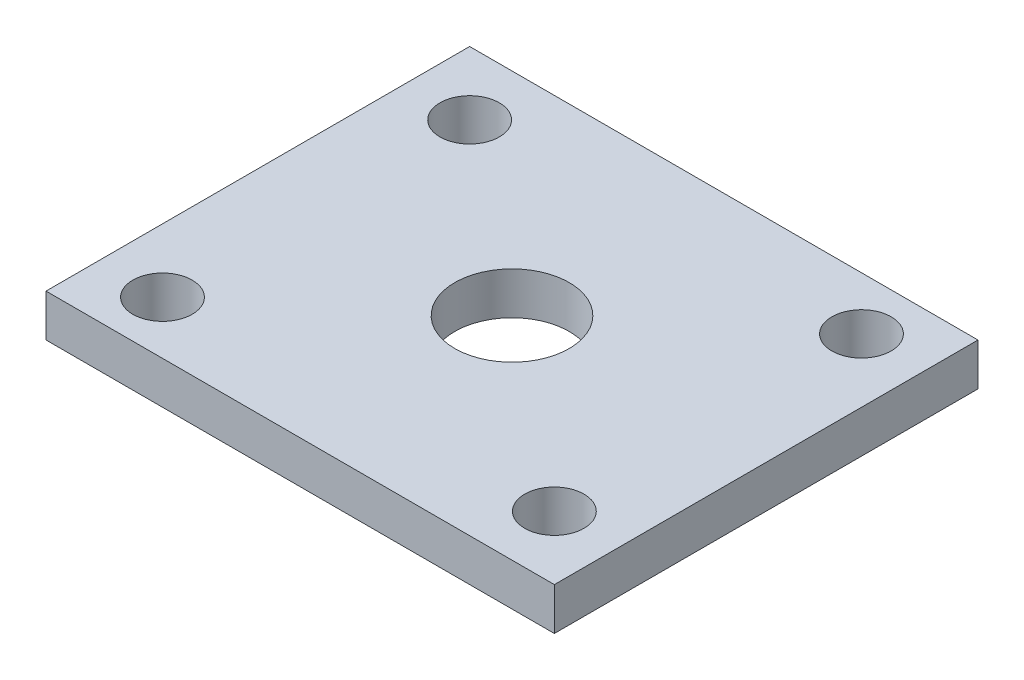
ISO-10303-21;
HEADER;
FILE_DESCRIPTION(('STEP AP214'),'2;1');
FILE_NAME('part.step','',(''),(''),'','','');
FILE_SCHEMA(('AUTOMOTIVE_DESIGN { 1 0 10303 214 1 1 1 1 }'));
ENDSEC;
DATA;
#1=APPLICATION_CONTEXT('core data for automotive mechanical design processes');
#2=APPLICATION_PROTOCOL_DEFINITION('international standard','automotive_design',2000,#1);
#3=PRODUCT_CONTEXT('',#1,'mechanical');
#4=PRODUCT('Part','Part','',(#3));
#5=PRODUCT_RELATED_PRODUCT_CATEGORY('part','',(#4));
#6=PRODUCT_DEFINITION_FORMATION('','',#4);
#7=PRODUCT_DEFINITION_CONTEXT('part definition',#1,'design');
#8=PRODUCT_DEFINITION('design','',#6,#7);
#9=PRODUCT_DEFINITION_SHAPE('','',#8);
#10=(LENGTH_UNIT() NAMED_UNIT(*) SI_UNIT(.MILLI.,.METRE.));
#11=(NAMED_UNIT(*) PLANE_ANGLE_UNIT() SI_UNIT($,.RADIAN.));
#12=(NAMED_UNIT(*) SI_UNIT($,.STERADIAN.) SOLID_ANGLE_UNIT());
#13=UNCERTAINTY_MEASURE_WITH_UNIT(LENGTH_MEASURE(1.E-05),#10,'distance_accuracy_value','');
#14=(GEOMETRIC_REPRESENTATION_CONTEXT(3) GLOBAL_UNCERTAINTY_ASSIGNED_CONTEXT((#13)) GLOBAL_UNIT_ASSIGNED_CONTEXT((#10,
#11,#12)) REPRESENTATION_CONTEXT('',''));
#15=CARTESIAN_POINT('',(0.,0.,0.));
#16=DIRECTION('',(0.,0.,1.));
#17=DIRECTION('',(1.,0.,0.));
#18=AXIS2_PLACEMENT_3D('',#15,#16,#17);
#19=CARTESIAN_POINT('',(6.,1.,0.));
#20=DIRECTION('',(1.,0.,0.));
#21=DIRECTION('',(0.,0.,-1.));
#22=AXIS2_PLACEMENT_3D('',#19,#20,#21);
#23=PLANE('',#22);
#24=DIRECTION('',(0.,0.,1.));
#25=VECTOR('',#24,1.);
#26=CARTESIAN_POINT('',(6.,0.,0.));
#27=LINE('',#26,#25);
#28=CARTESIAN_POINT('',(6.,0.,-5.));
#29=VERTEX_POINT('',#28);
#30=CARTESIAN_POINT('',(6.,0.,5.));
#31=VERTEX_POINT('',#30);
#32=EDGE_CURVE('E121',#29,#31,#27,.T.);
#33=ORIENTED_EDGE('',*,*,#32,.F.);
#34=DIRECTION('',(0.,-1.,0.));
#35=VECTOR('',#34,1.);
#36=CARTESIAN_POINT('',(6.,1.,-5.));
#37=LINE('',#36,#35);
#38=CARTESIAN_POINT('',(6.,1.,-5.));
#39=VERTEX_POINT('',#38);
#40=EDGE_CURVE('E11',#39,#29,#37,.T.);
#41=ORIENTED_EDGE('',*,*,#40,.F.);
#42=DIRECTION('',(0.,0.,1.));
#43=VECTOR('',#42,1.);
#44=CARTESIAN_POINT('',(6.,1.,0.));
#45=LINE('',#44,#43);
#46=CARTESIAN_POINT('',(6.,1.,5.));
#47=VERTEX_POINT('',#46);
#48=EDGE_CURVE('E99',#39,#47,#45,.T.);
#49=ORIENTED_EDGE('',*,*,#48,.T.);
#50=DIRECTION('',(0.,-1.,0.));
#51=VECTOR('',#50,1.);
#52=CARTESIAN_POINT('',(6.,1.,5.));
#53=LINE('',#52,#51);
#54=EDGE_CURVE('E77',#47,#31,#53,.T.);
#55=ORIENTED_EDGE('',*,*,#54,.T.);
#56=EDGE_LOOP('',(#33,#41,#49,#55));
#57=FACE_BOUND('',#56,.T.);
#58=ADVANCED_FACE('F37',(#57),#23,.T.);
#59=CARTESIAN_POINT('',(0.,1.,-5.));
#60=DIRECTION('',(0.,0.,-1.));
#61=DIRECTION('',(-1.,0.,0.));
#62=AXIS2_PLACEMENT_3D('',#59,#60,#61);
#63=PLANE('',#62);
#64=DIRECTION('',(1.,0.,0.));
#65=VECTOR('',#64,1.);
#66=CARTESIAN_POINT('',(0.,0.,-5.));
#67=LINE('',#66,#65);
#68=CARTESIAN_POINT('',(-6.,0.,-5.));
#69=VERTEX_POINT('',#68);
#70=EDGE_CURVE('E89',#69,#29,#67,.T.);
#71=ORIENTED_EDGE('',*,*,#70,.F.);
#72=DIRECTION('',(0.,-1.,0.));
#73=VECTOR('',#72,1.);
#74=CARTESIAN_POINT('',(-6.,1.,-5.));
#75=LINE('',#74,#73);
#76=CARTESIAN_POINT('',(-6.,1.,-5.));
#77=VERTEX_POINT('',#76);
#78=EDGE_CURVE('E46',#77,#69,#75,.T.);
#79=ORIENTED_EDGE('',*,*,#78,.F.);
#80=DIRECTION('',(1.,0.,0.));
#81=VECTOR('',#80,1.);
#82=CARTESIAN_POINT('',(0.,1.,-5.));
#83=LINE('',#82,#81);
#84=EDGE_CURVE('E87',#77,#39,#83,.T.);
#85=ORIENTED_EDGE('',*,*,#84,.T.);
#86=ORIENTED_EDGE('',*,*,#40,.T.);
#87=EDGE_LOOP('',(#71,#79,#85,#86));
#88=FACE_BOUND('',#87,.T.);
#89=ADVANCED_FACE('F85',(#88),#63,.T.);
#90=CARTESIAN_POINT('',(-6.,1.,0.));
#91=DIRECTION('',(1.,0.,0.));
#92=DIRECTION('',(0.,0.,-1.));
#93=AXIS2_PLACEMENT_3D('',#90,#91,#92);
#94=PLANE('',#93);
#95=DIRECTION('',(0.,0.,1.));
#96=VECTOR('',#95,1.);
#97=CARTESIAN_POINT('',(-6.,0.,0.));
#98=LINE('',#97,#96);
#99=CARTESIAN_POINT('',(-6.,0.,5.));
#100=VERTEX_POINT('',#99);
#101=EDGE_CURVE('E124',#69,#100,#98,.T.);
#102=ORIENTED_EDGE('',*,*,#101,.T.);
#103=DIRECTION('',(0.,-1.,0.));
#104=VECTOR('',#103,1.);
#105=CARTESIAN_POINT('',(-6.,1.,5.));
#106=LINE('',#105,#104);
#107=CARTESIAN_POINT('',(-6.,1.,5.));
#108=VERTEX_POINT('',#107);
#109=EDGE_CURVE('E92',#108,#100,#106,.T.);
#110=ORIENTED_EDGE('',*,*,#109,.F.);
#111=DIRECTION('',(0.,0.,1.));
#112=VECTOR('',#111,1.);
#113=CARTESIAN_POINT('',(-6.,1.,0.));
#114=LINE('',#113,#112);
#115=EDGE_CURVE('E94',#77,#108,#114,.T.);
#116=ORIENTED_EDGE('',*,*,#115,.F.);
#117=ORIENTED_EDGE('',*,*,#78,.T.);
#118=EDGE_LOOP('',(#102,#110,#116,#117));
#119=FACE_BOUND('',#118,.T.);
#120=ADVANCED_FACE('F95',(#119),#94,.F.);
#121=CARTESIAN_POINT('',(0.,1.,5.));
#122=DIRECTION('',(0.,0.,-1.));
#123=DIRECTION('',(-1.,0.,0.));
#124=AXIS2_PLACEMENT_3D('',#121,#122,#123);
#125=PLANE('',#124);
#126=DIRECTION('',(1.,0.,0.));
#127=VECTOR('',#126,1.);
#128=CARTESIAN_POINT('',(0.,0.,5.));
#129=LINE('',#128,#127);
#130=EDGE_CURVE('E70',#100,#31,#129,.T.);
#131=ORIENTED_EDGE('',*,*,#130,.T.);
#132=ORIENTED_EDGE('',*,*,#54,.F.);
#133=DIRECTION('',(1.,0.,0.));
#134=VECTOR('',#133,1.);
#135=CARTESIAN_POINT('',(0.,1.,5.));
#136=LINE('',#135,#134);
#137=EDGE_CURVE('E54',#108,#47,#136,.T.);
#138=ORIENTED_EDGE('',*,*,#137,.F.);
#139=ORIENTED_EDGE('',*,*,#109,.T.);
#140=EDGE_LOOP('',(#131,#132,#138,#139));
#141=FACE_BOUND('',#140,.T.);
#142=ADVANCED_FACE('F133',(#141),#125,.F.);
#143=CARTESIAN_POINT('',(-4.5,1.,-3.5));
#144=DIRECTION('',(0.,-1.,0.));
#145=DIRECTION('',(0.,0.,-1.));
#146=AXIS2_PLACEMENT_3D('',#143,#144,#145);
#147=CYLINDRICAL_SURFACE('',#146,0.7);
#148=CARTESIAN_POINT('',(-4.5,1.,-3.5));
#149=DIRECTION('',(0.,1.,0.));
#150=DIRECTION('',(0.,0.,1.));
#151=AXIS2_PLACEMENT_3D('',#148,#149,#150);
#152=CIRCLE('',#151,0.7);
#153=CARTESIAN_POINT('',(-4.5,1.,-2.8));
#154=VERTEX_POINT('',#153);
#155=EDGE_CURVE('E101',#154,#154,#152,.T.);
#156=ORIENTED_EDGE('',*,*,#155,.T.);
#157=EDGE_LOOP('',(#156));
#158=FACE_BOUND('',#157,.T.);
#159=CARTESIAN_POINT('',(-4.5,0.,-3.5));
#160=DIRECTION('',(0.,1.,0.));
#161=DIRECTION('',(0.,0.,1.));
#162=AXIS2_PLACEMENT_3D('',#159,#160,#161);
#163=CIRCLE('',#162,0.7);
#164=CARTESIAN_POINT('',(-4.5,0.,-2.8));
#165=VERTEX_POINT('',#164);
#166=EDGE_CURVE('E118',#165,#165,#163,.T.);
#167=ORIENTED_EDGE('',*,*,#166,.F.);
#168=EDGE_LOOP('',(#167));
#169=FACE_BOUND('',#168,.T.);
#170=ADVANCED_FACE('F144',(#158,#169),#147,.F.);
#171=CARTESIAN_POINT('',(4.5,1.,3.5));
#172=DIRECTION('',(0.,-1.,0.));
#173=DIRECTION('',(0.,0.,-1.));
#174=AXIS2_PLACEMENT_3D('',#171,#172,#173);
#175=CYLINDRICAL_SURFACE('',#174,0.7);
#176=CARTESIAN_POINT('',(4.5,1.,3.5));
#177=DIRECTION('',(0.,1.,0.));
#178=DIRECTION('',(0.,0.,1.));
#179=AXIS2_PLACEMENT_3D('',#176,#177,#178);
#180=CIRCLE('',#179,0.7);
#181=CARTESIAN_POINT('',(4.5,1.,4.2));
#182=VERTEX_POINT('',#181);
#183=EDGE_CURVE('E269',#182,#182,#180,.T.);
#184=ORIENTED_EDGE('',*,*,#183,.T.);
#185=EDGE_LOOP('',(#184));
#186=FACE_BOUND('',#185,.T.);
#187=CARTESIAN_POINT('',(4.5,0.,3.5));
#188=DIRECTION('',(0.,1.,0.));
#189=DIRECTION('',(0.,0.,1.));
#190=AXIS2_PLACEMENT_3D('',#187,#188,#189);
#191=CIRCLE('',#190,0.7);
#192=CARTESIAN_POINT('',(4.5,0.,4.2));
#193=VERTEX_POINT('',#192);
#194=EDGE_CURVE('E115',#193,#193,#191,.T.);
#195=ORIENTED_EDGE('',*,*,#194,.F.);
#196=EDGE_LOOP('',(#195));
#197=FACE_BOUND('',#196,.T.);
#198=ADVANCED_FACE('F147',(#186,#197),#175,.F.);
#199=CARTESIAN_POINT('',(4.5,1.,-3.75));
#200=DIRECTION('',(0.,-1.,0.));
#201=DIRECTION('',(0.,0.,-1.));
#202=AXIS2_PLACEMENT_3D('',#199,#200,#201);
#203=CYLINDRICAL_SURFACE('',#202,0.7);
#204=CARTESIAN_POINT('',(4.5,1.,-3.75));
#205=DIRECTION('',(0.,1.,0.));
#206=DIRECTION('',(0.,0.,1.));
#207=AXIS2_PLACEMENT_3D('',#204,#205,#206);
#208=CIRCLE('',#207,0.7);
#209=CARTESIAN_POINT('',(4.5,1.,-3.05));
#210=VERTEX_POINT('',#209);
#211=EDGE_CURVE('E162',#210,#210,#208,.T.);
#212=ORIENTED_EDGE('',*,*,#211,.T.);
#213=EDGE_LOOP('',(#212));
#214=FACE_BOUND('',#213,.T.);
#215=CARTESIAN_POINT('',(4.5,0.,-3.75));
#216=DIRECTION('',(0.,1.,0.));
#217=DIRECTION('',(0.,0.,1.));
#218=AXIS2_PLACEMENT_3D('',#215,#216,#217);
#219=CIRCLE('',#218,0.7);
#220=CARTESIAN_POINT('',(4.5,0.,-3.05));
#221=VERTEX_POINT('',#220);
#222=EDGE_CURVE('E112',#221,#221,#219,.T.);
#223=ORIENTED_EDGE('',*,*,#222,.F.);
#224=EDGE_LOOP('',(#223));
#225=FACE_BOUND('',#224,.T.);
#226=ADVANCED_FACE('F150',(#214,#225),#203,.F.);
#227=CARTESIAN_POINT('',(-4.5,1.,3.75));
#228=DIRECTION('',(0.,-1.,0.));
#229=DIRECTION('',(0.,0.,-1.));
#230=AXIS2_PLACEMENT_3D('',#227,#228,#229);
#231=CYLINDRICAL_SURFACE('',#230,0.7);
#232=CARTESIAN_POINT('',(-4.5,1.,3.75));
#233=DIRECTION('',(0.,1.,0.));
#234=DIRECTION('',(0.,0.,1.));
#235=AXIS2_PLACEMENT_3D('',#232,#233,#234);
#236=CIRCLE('',#235,0.7);
#237=CARTESIAN_POINT('',(-4.5,1.,4.45));
#238=VERTEX_POINT('',#237);
#239=EDGE_CURVE('E130',#238,#238,#236,.T.);
#240=ORIENTED_EDGE('',*,*,#239,.T.);
#241=EDGE_LOOP('',(#240));
#242=FACE_BOUND('',#241,.T.);
#243=CARTESIAN_POINT('',(-4.5,0.,3.75));
#244=DIRECTION('',(0.,1.,0.));
#245=DIRECTION('',(0.,0.,1.));
#246=AXIS2_PLACEMENT_3D('',#243,#244,#245);
#247=CIRCLE('',#246,0.7);
#248=CARTESIAN_POINT('',(-4.5,0.,4.45));
#249=VERTEX_POINT('',#248);
#250=EDGE_CURVE('E109',#249,#249,#247,.T.);
#251=ORIENTED_EDGE('',*,*,#250,.F.);
#252=EDGE_LOOP('',(#251));
#253=FACE_BOUND('',#252,.T.);
#254=ADVANCED_FACE('F39',(#242,#253),#231,.F.);
#255=CARTESIAN_POINT('',(0.,1.,0.));
#256=DIRECTION('',(0.,-1.,0.));
#257=DIRECTION('',(0.,0.,-1.));
#258=AXIS2_PLACEMENT_3D('',#255,#256,#257);
#259=CYLINDRICAL_SURFACE('',#258,1.35);
#260=CARTESIAN_POINT('',(0.,1.,0.));
#261=DIRECTION('',(0.,1.,0.));
#262=DIRECTION('',(0.,0.,1.));
#263=AXIS2_PLACEMENT_3D('',#260,#261,#262);
#264=CIRCLE('',#263,1.35);
#265=CARTESIAN_POINT('',(0.,1.,1.35000000000001));
#266=VERTEX_POINT('',#265);
#267=EDGE_CURVE('E106',#266,#266,#264,.T.);
#268=ORIENTED_EDGE('',*,*,#267,.T.);
#269=EDGE_LOOP('',(#268));
#270=FACE_BOUND('',#269,.T.);
#271=CARTESIAN_POINT('',(0.,0.,0.));
#272=DIRECTION('',(0.,1.,0.));
#273=DIRECTION('',(0.,0.,1.));
#274=AXIS2_PLACEMENT_3D('',#271,#272,#273);
#275=CIRCLE('',#274,1.35);
#276=CARTESIAN_POINT('',(0.,0.,1.35000000000001));
#277=VERTEX_POINT('',#276);
#278=EDGE_CURVE('E127',#277,#277,#275,.T.);
#279=ORIENTED_EDGE('',*,*,#278,.F.);
#280=EDGE_LOOP('',(#279));
#281=FACE_BOUND('',#280,.T.);
#282=ADVANCED_FACE('F157',(#270,#281),#259,.F.);
#283=CARTESIAN_POINT('',(0.,1.,0.));
#284=DIRECTION('',(0.,1.,0.));
#285=DIRECTION('',(0.,0.,1.));
#286=AXIS2_PLACEMENT_3D('',#283,#284,#285);
#287=PLANE('',#286);
#288=ORIENTED_EDGE('',*,*,#239,.F.);
#289=EDGE_LOOP('',(#288));
#290=FACE_BOUND('',#289,.T.);
#291=ORIENTED_EDGE('',*,*,#211,.F.);
#292=EDGE_LOOP('',(#291));
#293=FACE_BOUND('',#292,.T.);
#294=ORIENTED_EDGE('',*,*,#183,.F.);
#295=EDGE_LOOP('',(#294));
#296=FACE_BOUND('',#295,.T.);
#297=ORIENTED_EDGE('',*,*,#155,.F.);
#298=EDGE_LOOP('',(#297));
#299=FACE_BOUND('',#298,.T.);
#300=ORIENTED_EDGE('',*,*,#48,.F.);
#301=ORIENTED_EDGE('',*,*,#84,.F.);
#302=ORIENTED_EDGE('',*,*,#115,.T.);
#303=ORIENTED_EDGE('',*,*,#137,.T.);
#304=EDGE_LOOP('',(#300,#301,#302,#303));
#305=FACE_BOUND('',#304,.T.);
#306=ORIENTED_EDGE('',*,*,#267,.F.);
#307=EDGE_LOOP('',(#306));
#308=FACE_BOUND('',#307,.T.);
#309=ADVANCED_FACE('F97',(#290,#293,#296,#299,#305,#308),#287,.T.);
#310=CARTESIAN_POINT('',(0.,0.,0.));
#311=DIRECTION('',(0.,1.,0.));
#312=DIRECTION('',(0.,0.,1.));
#313=AXIS2_PLACEMENT_3D('',#310,#311,#312);
#314=PLANE('',#313);
#315=ORIENTED_EDGE('',*,*,#250,.T.);
#316=EDGE_LOOP('',(#315));
#317=FACE_BOUND('',#316,.T.);
#318=ORIENTED_EDGE('',*,*,#222,.T.);
#319=EDGE_LOOP('',(#318));
#320=FACE_BOUND('',#319,.T.);
#321=ORIENTED_EDGE('',*,*,#194,.T.);
#322=EDGE_LOOP('',(#321));
#323=FACE_BOUND('',#322,.T.);
#324=ORIENTED_EDGE('',*,*,#166,.T.);
#325=EDGE_LOOP('',(#324));
#326=FACE_BOUND('',#325,.T.);
#327=ORIENTED_EDGE('',*,*,#32,.T.);
#328=ORIENTED_EDGE('',*,*,#130,.F.);
#329=ORIENTED_EDGE('',*,*,#101,.F.);
#330=ORIENTED_EDGE('',*,*,#70,.T.);
#331=EDGE_LOOP('',(#327,#328,#329,#330));
#332=FACE_BOUND('',#331,.T.);
#333=ORIENTED_EDGE('',*,*,#278,.T.);
#334=EDGE_LOOP('',(#333));
#335=FACE_BOUND('',#334,.T.);
#336=ADVANCED_FACE('F134',(#317,#320,#323,#326,#332,#335),#314,.F.);
#337=CLOSED_SHELL('',(#58,#89,#120,#142,#170,#198,#226,#254,#282,#309,#336));
#338=MANIFOLD_SOLID_BREP('B2',#337);
#339=ADVANCED_BREP_SHAPE_REPRESENTATION('',(#18,#338),#14);
#340=SHAPE_DEFINITION_REPRESENTATION(#9,#339);
ENDSEC;
END-ISO-10303-21;
